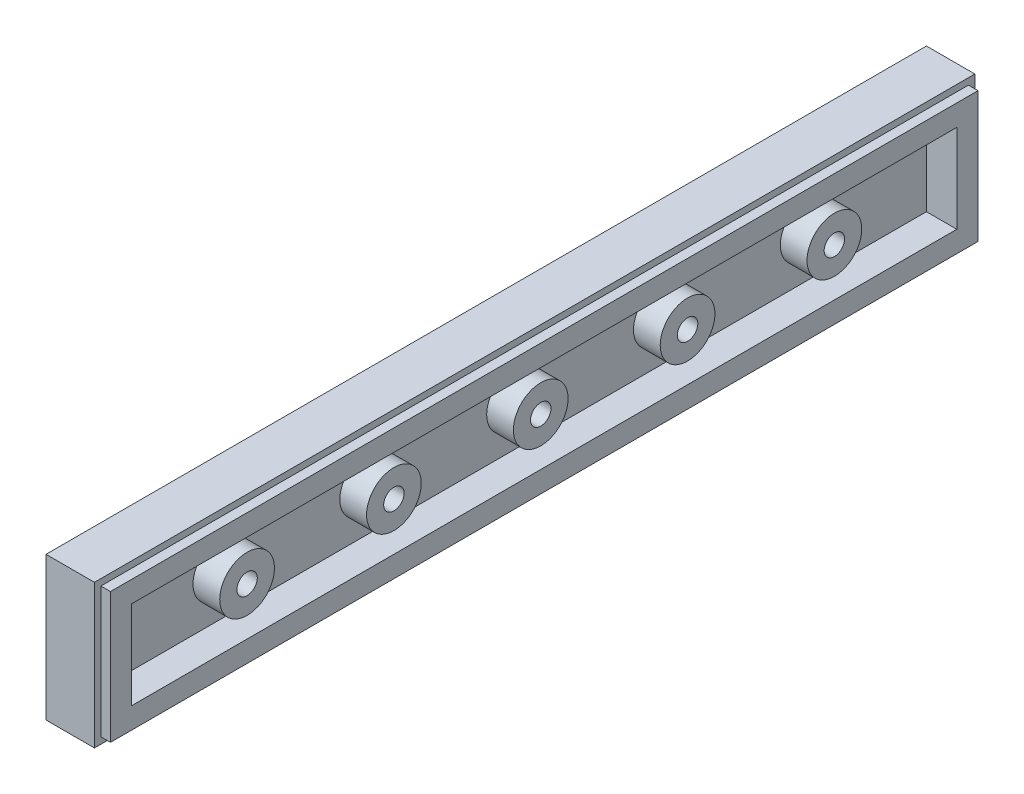
ISO-10303-21;
HEADER;
FILE_DESCRIPTION(('STEP AP214'),'2;1');
FILE_NAME('part.step','',(''),(''),'','','');
FILE_SCHEMA(('AUTOMOTIVE_DESIGN { 1 0 10303 214 1 1 1 1 }'));
ENDSEC;
DATA;
#1=APPLICATION_CONTEXT('core data for automotive mechanical design processes');
#2=APPLICATION_PROTOCOL_DEFINITION('international standard','automotive_design',2000,#1);
#3=PRODUCT_CONTEXT('',#1,'mechanical');
#4=PRODUCT('Part','Part','',(#3));
#5=PRODUCT_RELATED_PRODUCT_CATEGORY('part','',(#4));
#6=PRODUCT_DEFINITION_FORMATION('','',#4);
#7=PRODUCT_DEFINITION_CONTEXT('part definition',#1,'design');
#8=PRODUCT_DEFINITION('design','',#6,#7);
#9=PRODUCT_DEFINITION_SHAPE('','',#8);
#10=(LENGTH_UNIT() NAMED_UNIT(*) SI_UNIT(.MILLI.,.METRE.));
#11=(NAMED_UNIT(*) PLANE_ANGLE_UNIT() SI_UNIT($,.RADIAN.));
#12=(NAMED_UNIT(*) SI_UNIT($,.STERADIAN.) SOLID_ANGLE_UNIT());
#13=UNCERTAINTY_MEASURE_WITH_UNIT(LENGTH_MEASURE(1.E-05),#10,'distance_accuracy_value','');
#14=(GEOMETRIC_REPRESENTATION_CONTEXT(3) GLOBAL_UNCERTAINTY_ASSIGNED_CONTEXT((#13)) GLOBAL_UNIT_ASSIGNED_CONTEXT((#10,
#11,#12)) REPRESENTATION_CONTEXT('',''));
#15=CARTESIAN_POINT('',(0.,0.,0.));
#16=DIRECTION('',(0.,0.,1.));
#17=DIRECTION('',(1.,0.,0.));
#18=AXIS2_PLACEMENT_3D('',#15,#16,#17);
#19=CARTESIAN_POINT('',(2.63,3.895,-23.895));
#20=DIRECTION('',(0.,0.,1.));
#21=DIRECTION('',(1.,0.,0.));
#22=AXIS2_PLACEMENT_3D('',#19,#20,#21);
#23=PLANE('',#22);
#24=DIRECTION('',(0.,1.,0.));
#25=VECTOR('',#24,1.);
#26=CARTESIAN_POINT('',(0.,3.895,-23.895));
#27=LINE('',#26,#25);
#28=CARTESIAN_POINT('',(0.,-3.895,-23.895));
#29=VERTEX_POINT('',#28);
#30=CARTESIAN_POINT('',(0.,3.895,-23.895));
#31=VERTEX_POINT('',#30);
#32=EDGE_CURVE('E186',#29,#31,#27,.T.);
#33=ORIENTED_EDGE('',*,*,#32,.T.);
#34=DIRECTION('',(-1.,0.,0.));
#35=VECTOR('',#34,1.);
#36=CARTESIAN_POINT('',(2.63,3.895,-23.895));
#37=LINE('',#36,#35);
#38=CARTESIAN_POINT('',(2.63,3.895,-23.895));
#39=VERTEX_POINT('',#38);
#40=EDGE_CURVE('E221',#39,#31,#37,.T.);
#41=ORIENTED_EDGE('',*,*,#40,.F.);
#42=DIRECTION('',(0.,1.,0.));
#43=VECTOR('',#42,1.);
#44=CARTESIAN_POINT('',(2.63,3.895,-23.895));
#45=LINE('',#44,#43);
#46=CARTESIAN_POINT('',(2.63,-3.895,-23.895));
#47=VERTEX_POINT('',#46);
#48=EDGE_CURVE('E195',#47,#39,#45,.T.);
#49=ORIENTED_EDGE('',*,*,#48,.F.);
#50=DIRECTION('',(-1.,0.,0.));
#51=VECTOR('',#50,1.);
#52=CARTESIAN_POINT('',(2.63,-3.895,-23.895));
#53=LINE('',#52,#51);
#54=EDGE_CURVE('E205',#47,#29,#53,.T.);
#55=ORIENTED_EDGE('',*,*,#54,.T.);
#56=EDGE_LOOP('',(#33,#41,#49,#55));
#57=FACE_BOUND('',#56,.T.);
#58=ADVANCED_FACE('F36',(#57),#23,.F.);
#59=CARTESIAN_POINT('',(2.63,3.895,23.895));
#60=DIRECTION('',(0.,-1.,0.));
#61=DIRECTION('',(0.,0.,-1.));
#62=AXIS2_PLACEMENT_3D('',#59,#60,#61);
#63=PLANE('',#62);
#64=DIRECTION('',(0.,0.,1.));
#65=VECTOR('',#64,1.);
#66=CARTESIAN_POINT('',(0.,3.895,23.895));
#67=LINE('',#66,#65);
#68=CARTESIAN_POINT('',(0.,3.895,23.895));
#69=VERTEX_POINT('',#68);
#70=EDGE_CURVE('E208',#31,#69,#67,.T.);
#71=ORIENTED_EDGE('',*,*,#70,.T.);
#72=DIRECTION('',(-1.,0.,0.));
#73=VECTOR('',#72,1.);
#74=CARTESIAN_POINT('',(2.63,3.895,23.895));
#75=LINE('',#74,#73);
#76=CARTESIAN_POINT('',(2.63,3.895,23.895));
#77=VERTEX_POINT('',#76);
#78=EDGE_CURVE('E218',#77,#69,#75,.T.);
#79=ORIENTED_EDGE('',*,*,#78,.F.);
#80=DIRECTION('',(0.,0.,1.));
#81=VECTOR('',#80,1.);
#82=CARTESIAN_POINT('',(2.63,3.895,23.895));
#83=LINE('',#82,#81);
#84=EDGE_CURVE('E198',#39,#77,#83,.T.);
#85=ORIENTED_EDGE('',*,*,#84,.F.);
#86=ORIENTED_EDGE('',*,*,#40,.T.);
#87=EDGE_LOOP('',(#71,#79,#85,#86));
#88=FACE_BOUND('',#87,.T.);
#89=ADVANCED_FACE('F265',(#88),#63,.F.);
#90=CARTESIAN_POINT('',(2.63,3.895,23.895));
#91=DIRECTION('',(0.,0.,-1.));
#92=DIRECTION('',(-1.,0.,0.));
#93=AXIS2_PLACEMENT_3D('',#90,#91,#92);
#94=PLANE('',#93);
#95=DIRECTION('',(0.,-1.,0.));
#96=VECTOR('',#95,1.);
#97=CARTESIAN_POINT('',(0.,3.895,23.895));
#98=LINE('',#97,#96);
#99=CARTESIAN_POINT('',(0.,-3.895,23.895));
#100=VERTEX_POINT('',#99);
#101=EDGE_CURVE('E210',#69,#100,#98,.T.);
#102=ORIENTED_EDGE('',*,*,#101,.T.);
#103=DIRECTION('',(-1.,0.,0.));
#104=VECTOR('',#103,1.);
#105=CARTESIAN_POINT('',(2.63,-3.895,23.895));
#106=LINE('',#105,#104);
#107=CARTESIAN_POINT('',(2.63,-3.895,23.895));
#108=VERTEX_POINT('',#107);
#109=EDGE_CURVE('E215',#108,#100,#106,.T.);
#110=ORIENTED_EDGE('',*,*,#109,.F.);
#111=DIRECTION('',(0.,-1.,0.));
#112=VECTOR('',#111,1.);
#113=CARTESIAN_POINT('',(2.63,3.895,23.895));
#114=LINE('',#113,#112);
#115=EDGE_CURVE('E201',#77,#108,#114,.T.);
#116=ORIENTED_EDGE('',*,*,#115,.F.);
#117=ORIENTED_EDGE('',*,*,#78,.T.);
#118=EDGE_LOOP('',(#102,#110,#116,#117));
#119=FACE_BOUND('',#118,.T.);
#120=ADVANCED_FACE('F270',(#119),#94,.F.);
#121=CARTESIAN_POINT('',(2.63,-3.895,23.895));
#122=DIRECTION('',(0.,1.,0.));
#123=DIRECTION('',(0.,0.,1.));
#124=AXIS2_PLACEMENT_3D('',#121,#122,#123);
#125=PLANE('',#124);
#126=DIRECTION('',(0.,0.,-1.));
#127=VECTOR('',#126,1.);
#128=CARTESIAN_POINT('',(0.,-3.895,23.895));
#129=LINE('',#128,#127);
#130=EDGE_CURVE('E199',#100,#29,#129,.T.);
#131=ORIENTED_EDGE('',*,*,#130,.T.);
#132=ORIENTED_EDGE('',*,*,#54,.F.);
#133=DIRECTION('',(0.,0.,-1.));
#134=VECTOR('',#133,1.);
#135=CARTESIAN_POINT('',(2.63,-3.895,23.895));
#136=LINE('',#135,#134);
#137=EDGE_CURVE('E203',#108,#47,#136,.T.);
#138=ORIENTED_EDGE('',*,*,#137,.F.);
#139=ORIENTED_EDGE('',*,*,#109,.T.);
#140=EDGE_LOOP('',(#131,#132,#138,#139));
#141=FACE_BOUND('',#140,.T.);
#142=ADVANCED_FACE('F287',(#141),#125,.F.);
#143=CARTESIAN_POINT('',(2.63,0.,0.));
#144=DIRECTION('',(1.,0.,0.));
#145=DIRECTION('',(0.,0.,-1.));
#146=AXIS2_PLACEMENT_3D('',#143,#144,#145);
#147=PLANE('',#146);
#148=DIRECTION('',(0.,-1.,0.));
#149=VECTOR('',#148,1.);
#150=CARTESIAN_POINT('',(2.63,-3.54500000000001,23.545));
#151=LINE('',#150,#149);
#152=CARTESIAN_POINT('',(2.63,3.545,23.545));
#153=VERTEX_POINT('',#152);
#154=CARTESIAN_POINT('',(2.63,-3.54500000000001,23.545));
#155=VERTEX_POINT('',#154);
#156=EDGE_CURVE('E50',#153,#155,#151,.T.);
#157=ORIENTED_EDGE('',*,*,#156,.F.);
#158=DIRECTION('',(0.,0.,1.));
#159=VECTOR('',#158,1.);
#160=CARTESIAN_POINT('',(2.63,3.545,23.545));
#161=LINE('',#160,#159);
#162=CARTESIAN_POINT('',(2.63,3.545,-23.545));
#163=VERTEX_POINT('',#162);
#164=EDGE_CURVE('E54',#163,#153,#161,.T.);
#165=ORIENTED_EDGE('',*,*,#164,.F.);
#166=DIRECTION('',(0.,1.,0.));
#167=VECTOR('',#166,1.);
#168=CARTESIAN_POINT('',(2.63,3.545,-23.545));
#169=LINE('',#168,#167);
#170=CARTESIAN_POINT('',(2.63,-3.545,-23.545));
#171=VERTEX_POINT('',#170);
#172=EDGE_CURVE('E167',#171,#163,#169,.T.);
#173=ORIENTED_EDGE('',*,*,#172,.F.);
#174=DIRECTION('',(0.,0.,-1.));
#175=VECTOR('',#174,1.);
#176=CARTESIAN_POINT('',(2.63,-3.545,-23.545));
#177=LINE('',#176,#175);
#178=EDGE_CURVE('E164',#155,#171,#177,.T.);
#179=ORIENTED_EDGE('',*,*,#178,.F.);
#180=EDGE_LOOP('',(#157,#165,#173,#179));
#181=FACE_BOUND('',#180,.T.);
#182=ORIENTED_EDGE('',*,*,#48,.T.);
#183=ORIENTED_EDGE('',*,*,#84,.T.);
#184=ORIENTED_EDGE('',*,*,#115,.T.);
#185=ORIENTED_EDGE('',*,*,#137,.T.);
#186=EDGE_LOOP('',(#182,#183,#184,#185));
#187=FACE_BOUND('',#186,.T.);
#188=ADVANCED_FACE('F283',(#181,#187),#147,.T.);
#189=CARTESIAN_POINT('',(0.,0.,0.));
#190=DIRECTION('',(1.,0.,0.));
#191=DIRECTION('',(0.,0.,-1.));
#192=AXIS2_PLACEMENT_3D('',#189,#190,#191);
#193=PLANE('',#192);
#194=ORIENTED_EDGE('',*,*,#32,.F.);
#195=ORIENTED_EDGE('',*,*,#130,.F.);
#196=ORIENTED_EDGE('',*,*,#101,.F.);
#197=ORIENTED_EDGE('',*,*,#70,.F.);
#198=EDGE_LOOP('',(#194,#195,#196,#197));
#199=FACE_BOUND('',#198,.T.);
#200=ADVANCED_FACE('F278',(#199),#193,.F.);
#201=CARTESIAN_POINT('',(3.15,0.,0.));
#202=DIRECTION('',(-1.,0.,0.));
#203=DIRECTION('',(0.,0.,1.));
#204=AXIS2_PLACEMENT_3D('',#201,#202,#203);
#205=PLANE('',#204);
#206=DIRECTION('',(0.,-1.,0.));
#207=VECTOR('',#206,1.);
#208=CARTESIAN_POINT('',(3.15,-3.54500000000001,23.545));
#209=LINE('',#208,#207);
#210=CARTESIAN_POINT('',(3.15,3.545,23.545));
#211=VERTEX_POINT('',#210);
#212=CARTESIAN_POINT('',(3.15,-3.54500000000001,23.545));
#213=VERTEX_POINT('',#212);
#214=EDGE_CURVE('E153',#211,#213,#209,.T.);
#215=ORIENTED_EDGE('',*,*,#214,.T.);
#216=DIRECTION('',(0.,0.,-1.));
#217=VECTOR('',#216,1.);
#218=CARTESIAN_POINT('',(3.15,-3.545,-23.545));
#219=LINE('',#218,#217);
#220=CARTESIAN_POINT('',(3.15,-3.545,-23.545));
#221=VERTEX_POINT('',#220);
#222=EDGE_CURVE('E156',#213,#221,#219,.T.);
#223=ORIENTED_EDGE('',*,*,#222,.T.);
#224=DIRECTION('',(0.,1.,0.));
#225=VECTOR('',#224,1.);
#226=CARTESIAN_POINT('',(3.15,3.545,-23.545));
#227=LINE('',#226,#225);
#228=CARTESIAN_POINT('',(3.15,3.545,-23.545));
#229=VERTEX_POINT('',#228);
#230=EDGE_CURVE('E158',#221,#229,#227,.T.);
#231=ORIENTED_EDGE('',*,*,#230,.T.);
#232=DIRECTION('',(0.,0.,1.));
#233=VECTOR('',#232,1.);
#234=CARTESIAN_POINT('',(3.15,3.545,23.545));
#235=LINE('',#234,#233);
#236=EDGE_CURVE('E160',#229,#211,#235,.T.);
#237=ORIENTED_EDGE('',*,*,#236,.T.);
#238=EDGE_LOOP('',(#215,#223,#231,#237));
#239=FACE_BOUND('',#238,.T.);
#240=DIRECTION('',(0.,0.,1.));
#241=VECTOR('',#240,1.);
#242=CARTESIAN_POINT('',(3.15,2.395,-22.395));
#243=LINE('',#242,#241);
#244=CARTESIAN_POINT('',(3.15,2.395,-22.395));
#245=VERTEX_POINT('',#244);
#246=CARTESIAN_POINT('',(3.15,2.395,22.395));
#247=VERTEX_POINT('',#246);
#248=EDGE_CURVE('E136',#245,#247,#243,.T.);
#249=ORIENTED_EDGE('',*,*,#248,.F.);
#250=DIRECTION('',(0.,1.,0.));
#251=VECTOR('',#250,1.);
#252=CARTESIAN_POINT('',(3.15,-2.395,-22.395));
#253=LINE('',#252,#251);
#254=CARTESIAN_POINT('',(3.15,-2.395,-22.395));
#255=VERTEX_POINT('',#254);
#256=EDGE_CURVE('E148',#255,#245,#253,.T.);
#257=ORIENTED_EDGE('',*,*,#256,.F.);
#258=DIRECTION('',(0.,0.,-1.));
#259=VECTOR('',#258,1.);
#260=CARTESIAN_POINT('',(3.15,-2.395,22.395));
#261=LINE('',#260,#259);
#262=CARTESIAN_POINT('',(3.15,-2.395,22.395));
#263=VERTEX_POINT('',#262);
#264=EDGE_CURVE('E146',#263,#255,#261,.T.);
#265=ORIENTED_EDGE('',*,*,#264,.F.);
#266=DIRECTION('',(0.,-1.,0.));
#267=VECTOR('',#266,1.);
#268=CARTESIAN_POINT('',(3.15,2.395,22.395));
#269=LINE('',#268,#267);
#270=EDGE_CURVE('E128',#247,#263,#269,.T.);
#271=ORIENTED_EDGE('',*,*,#270,.F.);
#272=EDGE_LOOP('',(#249,#257,#265,#271));
#273=FACE_BOUND('',#272,.T.);
#274=ADVANCED_FACE('F144',(#239,#273),#205,.F.);
#275=CARTESIAN_POINT('',(3.15,-3.54500000000001,23.545));
#276=DIRECTION('',(0.,0.,-1.));
#277=DIRECTION('',(-1.,0.,0.));
#278=AXIS2_PLACEMENT_3D('',#275,#276,#277);
#279=PLANE('',#278);
#280=ORIENTED_EDGE('',*,*,#156,.T.);
#281=DIRECTION('',(-1.,0.,0.));
#282=VECTOR('',#281,1.);
#283=CARTESIAN_POINT('',(3.15,-3.54500000000001,23.545));
#284=LINE('',#283,#282);
#285=EDGE_CURVE('E178',#213,#155,#284,.T.);
#286=ORIENTED_EDGE('',*,*,#285,.F.);
#287=ORIENTED_EDGE('',*,*,#214,.F.);
#288=DIRECTION('',(-1.,0.,0.));
#289=VECTOR('',#288,1.);
#290=CARTESIAN_POINT('',(3.15,3.545,23.545));
#291=LINE('',#290,#289);
#292=EDGE_CURVE('E162',#211,#153,#291,.T.);
#293=ORIENTED_EDGE('',*,*,#292,.T.);
#294=EDGE_LOOP('',(#280,#286,#287,#293));
#295=FACE_BOUND('',#294,.T.);
#296=ADVANCED_FACE('F312',(#295),#279,.F.);
#297=CARTESIAN_POINT('',(3.15,-3.545,-23.545));
#298=DIRECTION('',(0.,1.,0.));
#299=DIRECTION('',(0.,0.,1.));
#300=AXIS2_PLACEMENT_3D('',#297,#298,#299);
#301=PLANE('',#300);
#302=ORIENTED_EDGE('',*,*,#178,.T.);
#303=DIRECTION('',(-1.,0.,0.));
#304=VECTOR('',#303,1.);
#305=CARTESIAN_POINT('',(3.15,-3.545,-23.545));
#306=LINE('',#305,#304);
#307=EDGE_CURVE('E175',#221,#171,#306,.T.);
#308=ORIENTED_EDGE('',*,*,#307,.F.);
#309=ORIENTED_EDGE('',*,*,#222,.F.);
#310=ORIENTED_EDGE('',*,*,#285,.T.);
#311=EDGE_LOOP('',(#302,#308,#309,#310));
#312=FACE_BOUND('',#311,.T.);
#313=ADVANCED_FACE('F320',(#312),#301,.F.);
#314=CARTESIAN_POINT('',(3.15,3.545,-23.545));
#315=DIRECTION('',(0.,0.,1.));
#316=DIRECTION('',(1.,0.,0.));
#317=AXIS2_PLACEMENT_3D('',#314,#315,#316);
#318=PLANE('',#317);
#319=ORIENTED_EDGE('',*,*,#172,.T.);
#320=DIRECTION('',(-1.,0.,0.));
#321=VECTOR('',#320,1.);
#322=CARTESIAN_POINT('',(3.15,3.545,-23.545));
#323=LINE('',#322,#321);
#324=EDGE_CURVE('E172',#229,#163,#323,.T.);
#325=ORIENTED_EDGE('',*,*,#324,.F.);
#326=ORIENTED_EDGE('',*,*,#230,.F.);
#327=ORIENTED_EDGE('',*,*,#307,.T.);
#328=EDGE_LOOP('',(#319,#325,#326,#327));
#329=FACE_BOUND('',#328,.T.);
#330=ADVANCED_FACE('F328',(#329),#318,.F.);
#331=CARTESIAN_POINT('',(3.15,3.545,23.545));
#332=DIRECTION('',(0.,-1.,0.));
#333=DIRECTION('',(0.,0.,-1.));
#334=AXIS2_PLACEMENT_3D('',#331,#332,#333);
#335=PLANE('',#334);
#336=ORIENTED_EDGE('',*,*,#164,.T.);
#337=ORIENTED_EDGE('',*,*,#292,.F.);
#338=ORIENTED_EDGE('',*,*,#236,.F.);
#339=ORIENTED_EDGE('',*,*,#324,.T.);
#340=EDGE_LOOP('',(#336,#337,#338,#339));
#341=FACE_BOUND('',#340,.T.);
#342=ADVANCED_FACE('F336',(#341),#335,.F.);
#343=CARTESIAN_POINT('',(1.5,0.,0.));
#344=DIRECTION('',(1.,0.,0.));
#345=DIRECTION('',(0.,0.,-1.));
#346=AXIS2_PLACEMENT_3D('',#343,#344,#345);
#347=PLANE('',#346);
#348=CARTESIAN_POINT('',(1.5,0.,-15.95));
#349=DIRECTION('',(1.,0.,0.));
#350=DIRECTION('',(0.,0.,-1.));
#351=AXIS2_PLACEMENT_3D('',#348,#349,#350);
#352=CIRCLE('',#351,1.485);
#353=CARTESIAN_POINT('',(1.5,0.,-17.435));
#354=VERTEX_POINT('',#353);
#355=EDGE_CURVE('E551',#354,#354,#352,.T.);
#356=ORIENTED_EDGE('',*,*,#355,.F.);
#357=EDGE_LOOP('',(#356));
#358=FACE_BOUND('',#357,.T.);
#359=CARTESIAN_POINT('',(1.5,0.,-7.98));
#360=DIRECTION('',(1.,0.,0.));
#361=DIRECTION('',(0.,0.,-1.));
#362=AXIS2_PLACEMENT_3D('',#359,#360,#361);
#363=CIRCLE('',#362,1.485);
#364=CARTESIAN_POINT('',(1.5,0.,-9.465));
#365=VERTEX_POINT('',#364);
#366=EDGE_CURVE('E558',#365,#365,#363,.T.);
#367=ORIENTED_EDGE('',*,*,#366,.F.);
#368=EDGE_LOOP('',(#367));
#369=FACE_BOUND('',#368,.T.);
#370=CARTESIAN_POINT('',(1.5,0.,-0.00999999999999959));
#371=DIRECTION('',(1.,0.,0.));
#372=DIRECTION('',(0.,0.,-1.));
#373=AXIS2_PLACEMENT_3D('',#370,#371,#372);
#374=CIRCLE('',#373,1.485);
#375=CARTESIAN_POINT('',(1.5,0.,-1.495));
#376=VERTEX_POINT('',#375);
#377=EDGE_CURVE('E567',#376,#376,#374,.T.);
#378=ORIENTED_EDGE('',*,*,#377,.F.);
#379=EDGE_LOOP('',(#378));
#380=FACE_BOUND('',#379,.T.);
#381=CARTESIAN_POINT('',(1.5,0.,7.96));
#382=DIRECTION('',(1.,0.,0.));
#383=DIRECTION('',(0.,0.,-1.));
#384=AXIS2_PLACEMENT_3D('',#381,#382,#383);
#385=CIRCLE('',#384,1.485);
#386=CARTESIAN_POINT('',(1.5,0.,6.475));
#387=VERTEX_POINT('',#386);
#388=EDGE_CURVE('E576',#387,#387,#385,.T.);
#389=ORIENTED_EDGE('',*,*,#388,.F.);
#390=EDGE_LOOP('',(#389));
#391=FACE_BOUND('',#390,.T.);
#392=CARTESIAN_POINT('',(1.5,0.,15.93));
#393=DIRECTION('',(1.,0.,0.));
#394=DIRECTION('',(0.,0.,-1.));
#395=AXIS2_PLACEMENT_3D('',#392,#393,#394);
#396=CIRCLE('',#395,1.485);
#397=CARTESIAN_POINT('',(1.5,0.,14.445));
#398=VERTEX_POINT('',#397);
#399=EDGE_CURVE('E585',#398,#398,#396,.T.);
#400=ORIENTED_EDGE('',*,*,#399,.F.);
#401=EDGE_LOOP('',(#400));
#402=FACE_BOUND('',#401,.T.);
#403=DIRECTION('',(0.,1.,0.));
#404=VECTOR('',#403,1.);
#405=CARTESIAN_POINT('',(1.5,3.895,-22.395));
#406=LINE('',#405,#404);
#407=CARTESIAN_POINT('',(1.5,-2.395,-22.395));
#408=VERTEX_POINT('',#407);
#409=CARTESIAN_POINT('',(1.5,2.395,-22.395));
#410=VERTEX_POINT('',#409);
#411=EDGE_CURVE('E181',#408,#410,#406,.T.);
#412=ORIENTED_EDGE('',*,*,#411,.T.);
#413=DIRECTION('',(0.,0.,1.));
#414=VECTOR('',#413,1.);
#415=CARTESIAN_POINT('',(1.5,2.395,23.895));
#416=LINE('',#415,#414);
#417=CARTESIAN_POINT('',(1.5,2.395,22.395));
#418=VERTEX_POINT('',#417);
#419=EDGE_CURVE('E184',#410,#418,#416,.T.);
#420=ORIENTED_EDGE('',*,*,#419,.T.);
#421=DIRECTION('',(0.,-1.,0.));
#422=VECTOR('',#421,1.);
#423=CARTESIAN_POINT('',(1.5,3.895,22.395));
#424=LINE('',#423,#422);
#425=CARTESIAN_POINT('',(1.5,-2.395,22.395));
#426=VERTEX_POINT('',#425);
#427=EDGE_CURVE('E130',#418,#426,#424,.T.);
#428=ORIENTED_EDGE('',*,*,#427,.T.);
#429=DIRECTION('',(0.,0.,-1.));
#430=VECTOR('',#429,1.);
#431=CARTESIAN_POINT('',(1.5,-2.395,23.895));
#432=LINE('',#431,#430);
#433=EDGE_CURVE('E190',#426,#408,#432,.T.);
#434=ORIENTED_EDGE('',*,*,#433,.T.);
#435=EDGE_LOOP('',(#412,#420,#428,#434));
#436=FACE_BOUND('',#435,.T.);
#437=ADVANCED_FACE('F253',(#358,#369,#380,#391,#402,#436),#347,.T.);
#438=CARTESIAN_POINT('',(2.63,2.395,23.895));
#439=DIRECTION('',(0.,-1.,0.));
#440=DIRECTION('',(0.,0.,-1.));
#441=AXIS2_PLACEMENT_3D('',#438,#439,#440);
#442=PLANE('',#441);
#443=ORIENTED_EDGE('',*,*,#419,.F.);
#444=DIRECTION('',(-1.,0.,0.));
#445=VECTOR('',#444,1.);
#446=CARTESIAN_POINT('',(2.63,2.395,-22.395));
#447=LINE('',#446,#445);
#448=EDGE_CURVE('E132',#245,#410,#447,.T.);
#449=ORIENTED_EDGE('',*,*,#448,.F.);
#450=ORIENTED_EDGE('',*,*,#248,.T.);
#451=DIRECTION('',(-1.,0.,0.));
#452=VECTOR('',#451,1.);
#453=CARTESIAN_POINT('',(2.63,2.395,22.395));
#454=LINE('',#453,#452);
#455=EDGE_CURVE('E123',#247,#418,#454,.T.);
#456=ORIENTED_EDGE('',*,*,#455,.T.);
#457=EDGE_LOOP('',(#443,#449,#450,#456));
#458=FACE_BOUND('',#457,.T.);
#459=ADVANCED_FACE('F137',(#458),#442,.T.);
#460=CARTESIAN_POINT('',(2.63,3.895,22.395));
#461=DIRECTION('',(0.,0.,-1.));
#462=DIRECTION('',(-1.,0.,0.));
#463=AXIS2_PLACEMENT_3D('',#460,#461,#462);
#464=PLANE('',#463);
#465=ORIENTED_EDGE('',*,*,#427,.F.);
#466=ORIENTED_EDGE('',*,*,#455,.F.);
#467=ORIENTED_EDGE('',*,*,#270,.T.);
#468=DIRECTION('',(-1.,0.,0.));
#469=VECTOR('',#468,1.);
#470=CARTESIAN_POINT('',(2.63,-2.395,22.395));
#471=LINE('',#470,#469);
#472=EDGE_CURVE('E133',#263,#426,#471,.T.);
#473=ORIENTED_EDGE('',*,*,#472,.T.);
#474=EDGE_LOOP('',(#465,#466,#467,#473));
#475=FACE_BOUND('',#474,.T.);
#476=ADVANCED_FACE('F125',(#475),#464,.T.);
#477=CARTESIAN_POINT('',(2.63,-2.395,23.895));
#478=DIRECTION('',(0.,1.,0.));
#479=DIRECTION('',(0.,0.,1.));
#480=AXIS2_PLACEMENT_3D('',#477,#478,#479);
#481=PLANE('',#480);
#482=ORIENTED_EDGE('',*,*,#433,.F.);
#483=ORIENTED_EDGE('',*,*,#472,.F.);
#484=ORIENTED_EDGE('',*,*,#264,.T.);
#485=DIRECTION('',(-1.,0.,0.));
#486=VECTOR('',#485,1.);
#487=CARTESIAN_POINT('',(2.63,-2.395,-22.395));
#488=LINE('',#487,#486);
#489=EDGE_CURVE('E187',#255,#408,#488,.T.);
#490=ORIENTED_EDGE('',*,*,#489,.T.);
#491=EDGE_LOOP('',(#482,#483,#484,#490));
#492=FACE_BOUND('',#491,.T.);
#493=ADVANCED_FACE('F366',(#492),#481,.T.);
#494=CARTESIAN_POINT('',(2.63,3.895,-22.395));
#495=DIRECTION('',(0.,0.,1.));
#496=DIRECTION('',(1.,0.,0.));
#497=AXIS2_PLACEMENT_3D('',#494,#495,#496);
#498=PLANE('',#497);
#499=ORIENTED_EDGE('',*,*,#411,.F.);
#500=ORIENTED_EDGE('',*,*,#489,.F.);
#501=ORIENTED_EDGE('',*,*,#256,.T.);
#502=ORIENTED_EDGE('',*,*,#448,.T.);
#503=EDGE_LOOP('',(#499,#500,#501,#502));
#504=FACE_BOUND('',#503,.T.);
#505=ADVANCED_FACE('F373',(#504),#498,.T.);
#506=CARTESIAN_POINT('',(7.3502142802481,0.,15.93));
#507=DIRECTION('',(-1.,0.,0.));
#508=DIRECTION('',(0.,0.,1.));
#509=AXIS2_PLACEMENT_3D('',#506,#507,#508);
#510=CYLINDRICAL_SURFACE('',#509,1.485);
#511=CARTESIAN_POINT('',(2.95,0.,15.93));
#512=DIRECTION('',(-1.,0.,0.));
#513=DIRECTION('',(0.,0.,1.));
#514=AXIS2_PLACEMENT_3D('',#511,#512,#513);
#515=CIRCLE('',#514,1.485);
#516=CARTESIAN_POINT('',(2.95,0.,17.415));
#517=VERTEX_POINT('',#516);
#518=EDGE_CURVE('E584',#517,#517,#515,.T.);
#519=ORIENTED_EDGE('',*,*,#518,.T.);
#520=EDGE_LOOP('',(#519));
#521=FACE_BOUND('',#520,.T.);
#522=ORIENTED_EDGE('',*,*,#399,.T.);
#523=EDGE_LOOP('',(#522));
#524=FACE_BOUND('',#523,.T.);
#525=ADVANCED_FACE('F379',(#521,#524),#510,.T.);
#526=CARTESIAN_POINT('',(7.3502142802481,0.,15.93));
#527=DIRECTION('',(-1.,0.,0.));
#528=DIRECTION('',(0.,0.,1.));
#529=AXIS2_PLACEMENT_3D('',#526,#527,#528);
#530=CYLINDRICAL_SURFACE('',#529,0.555);
#531=CARTESIAN_POINT('',(2.95,0.,15.93));
#532=DIRECTION('',(-1.,0.,0.));
#533=DIRECTION('',(0.,0.,1.));
#534=AXIS2_PLACEMENT_3D('',#531,#532,#533);
#535=CIRCLE('',#534,0.555);
#536=CARTESIAN_POINT('',(2.95,0.,16.485));
#537=VERTEX_POINT('',#536);
#538=EDGE_CURVE('E142',#537,#537,#535,.T.);
#539=ORIENTED_EDGE('',*,*,#538,.F.);
#540=EDGE_LOOP('',(#539));
#541=FACE_BOUND('',#540,.T.);
#542=CARTESIAN_POINT('',(1.5,0.,15.93));
#543=DIRECTION('',(1.,0.,0.));
#544=DIRECTION('',(0.,0.,-1.));
#545=AXIS2_PLACEMENT_3D('',#542,#543,#544);
#546=CIRCLE('',#545,0.555);
#547=CARTESIAN_POINT('',(1.5,0.,15.375));
#548=VERTEX_POINT('',#547);
#549=EDGE_CURVE('E224',#548,#548,#546,.F.);
#550=ORIENTED_EDGE('',*,*,#549,.T.);
#551=EDGE_LOOP('',(#550));
#552=FACE_BOUND('',#551,.T.);
#553=ADVANCED_FACE('F386',(#541,#552),#530,.F.);
#554=CARTESIAN_POINT('',(2.95,0.,0.));
#555=DIRECTION('',(-1.,0.,0.));
#556=DIRECTION('',(0.,0.,1.));
#557=AXIS2_PLACEMENT_3D('',#554,#555,#556);
#558=PLANE('',#557);
#559=ORIENTED_EDGE('',*,*,#538,.T.);
#560=EDGE_LOOP('',(#559));
#561=FACE_BOUND('',#560,.T.);
#562=ORIENTED_EDGE('',*,*,#518,.F.);
#563=EDGE_LOOP('',(#562));
#564=FACE_BOUND('',#563,.T.);
#565=ADVANCED_FACE('F394',(#561,#564),#558,.F.);
#566=ORIENTED_EDGE('',*,*,#549,.F.);
#567=EDGE_LOOP('',(#566));
#568=FACE_BOUND('',#567,.T.);
#569=ADVANCED_FACE('F353',(#568),#347,.T.);
#570=CARTESIAN_POINT('',(7.3502142802481,0.,7.96));
#571=DIRECTION('',(-1.,0.,0.));
#572=DIRECTION('',(0.,0.,1.));
#573=AXIS2_PLACEMENT_3D('',#570,#571,#572);
#574=CYLINDRICAL_SURFACE('',#573,1.485);
#575=CARTESIAN_POINT('',(2.95,0.,7.96));
#576=DIRECTION('',(-1.,0.,0.));
#577=DIRECTION('',(0.,0.,1.));
#578=AXIS2_PLACEMENT_3D('',#575,#576,#577);
#579=CIRCLE('',#578,1.485);
#580=CARTESIAN_POINT('',(2.95,0.,9.445));
#581=VERTEX_POINT('',#580);
#582=EDGE_CURVE('E575',#581,#581,#579,.T.);
#583=ORIENTED_EDGE('',*,*,#582,.T.);
#584=EDGE_LOOP('',(#583));
#585=FACE_BOUND('',#584,.T.);
#586=ORIENTED_EDGE('',*,*,#388,.T.);
#587=EDGE_LOOP('',(#586));
#588=FACE_BOUND('',#587,.T.);
#589=ADVANCED_FACE('F409',(#585,#588),#574,.T.);
#590=CARTESIAN_POINT('',(7.3502142802481,0.,7.96));
#591=DIRECTION('',(-1.,0.,0.));
#592=DIRECTION('',(0.,0.,1.));
#593=AXIS2_PLACEMENT_3D('',#590,#591,#592);
#594=CYLINDRICAL_SURFACE('',#593,0.555);
#595=CARTESIAN_POINT('',(2.95,0.,7.96));
#596=DIRECTION('',(-1.,0.,0.));
#597=DIRECTION('',(0.,0.,1.));
#598=AXIS2_PLACEMENT_3D('',#595,#596,#597);
#599=CIRCLE('',#598,0.555);
#600=CARTESIAN_POINT('',(2.95,0.,8.515));
#601=VERTEX_POINT('',#600);
#602=EDGE_CURVE('E579',#601,#601,#599,.T.);
#603=ORIENTED_EDGE('',*,*,#602,.F.);
#604=EDGE_LOOP('',(#603));
#605=FACE_BOUND('',#604,.T.);
#606=CARTESIAN_POINT('',(1.5,0.,7.96));
#607=DIRECTION('',(1.,0.,0.));
#608=DIRECTION('',(0.,0.,-1.));
#609=AXIS2_PLACEMENT_3D('',#606,#607,#608);
#610=CIRCLE('',#609,0.555);
#611=CARTESIAN_POINT('',(1.5,0.,7.405));
#612=VERTEX_POINT('',#611);
#613=EDGE_CURVE('E227',#612,#612,#610,.F.);
#614=ORIENTED_EDGE('',*,*,#613,.T.);
#615=EDGE_LOOP('',(#614));
#616=FACE_BOUND('',#615,.T.);
#617=ADVANCED_FACE('F416',(#605,#616),#594,.F.);
#618=CARTESIAN_POINT('',(2.95,0.,0.));
#619=DIRECTION('',(-1.,0.,0.));
#620=DIRECTION('',(0.,0.,1.));
#621=AXIS2_PLACEMENT_3D('',#618,#619,#620);
#622=PLANE('',#621);
#623=ORIENTED_EDGE('',*,*,#602,.T.);
#624=EDGE_LOOP('',(#623));
#625=FACE_BOUND('',#624,.T.);
#626=ORIENTED_EDGE('',*,*,#582,.F.);
#627=EDGE_LOOP('',(#626));
#628=FACE_BOUND('',#627,.T.);
#629=ADVANCED_FACE('F424',(#625,#628),#622,.F.);
#630=ORIENTED_EDGE('',*,*,#613,.F.);
#631=EDGE_LOOP('',(#630));
#632=FACE_BOUND('',#631,.T.);
#633=ADVANCED_FACE('F260',(#632),#347,.T.);
#634=CARTESIAN_POINT('',(7.3502142802481,0.,-0.00999999999999959));
#635=DIRECTION('',(-1.,0.,0.));
#636=DIRECTION('',(0.,0.,1.));
#637=AXIS2_PLACEMENT_3D('',#634,#635,#636);
#638=CYLINDRICAL_SURFACE('',#637,1.485);
#639=CARTESIAN_POINT('',(2.95,0.,-0.00999999999999959));
#640=DIRECTION('',(-1.,0.,0.));
#641=DIRECTION('',(0.,0.,1.));
#642=AXIS2_PLACEMENT_3D('',#639,#640,#641);
#643=CIRCLE('',#642,1.485);
#644=CARTESIAN_POINT('',(2.95,0.,1.475));
#645=VERTEX_POINT('',#644);
#646=EDGE_CURVE('E566',#645,#645,#643,.T.);
#647=ORIENTED_EDGE('',*,*,#646,.T.);
#648=EDGE_LOOP('',(#647));
#649=FACE_BOUND('',#648,.T.);
#650=ORIENTED_EDGE('',*,*,#377,.T.);
#651=EDGE_LOOP('',(#650));
#652=FACE_BOUND('',#651,.T.);
#653=ADVANCED_FACE('F439',(#649,#652),#638,.T.);
#654=CARTESIAN_POINT('',(7.3502142802481,0.,-0.00999999999999959));
#655=DIRECTION('',(-1.,0.,0.));
#656=DIRECTION('',(0.,0.,1.));
#657=AXIS2_PLACEMENT_3D('',#654,#655,#656);
#658=CYLINDRICAL_SURFACE('',#657,0.555);
#659=CARTESIAN_POINT('',(2.95,0.,-0.00999999999999959));
#660=DIRECTION('',(-1.,0.,0.));
#661=DIRECTION('',(0.,0.,1.));
#662=AXIS2_PLACEMENT_3D('',#659,#660,#661);
#663=CIRCLE('',#662,0.555);
#664=CARTESIAN_POINT('',(2.95,0.,0.545000000000001));
#665=VERTEX_POINT('',#664);
#666=EDGE_CURVE('E570',#665,#665,#663,.T.);
#667=ORIENTED_EDGE('',*,*,#666,.F.);
#668=EDGE_LOOP('',(#667));
#669=FACE_BOUND('',#668,.T.);
#670=CARTESIAN_POINT('',(1.5,0.,-0.00999999999999959));
#671=DIRECTION('',(1.,0.,0.));
#672=DIRECTION('',(0.,0.,-1.));
#673=AXIS2_PLACEMENT_3D('',#670,#671,#672);
#674=CIRCLE('',#673,0.555);
#675=CARTESIAN_POINT('',(1.5,0.,-0.565));
#676=VERTEX_POINT('',#675);
#677=EDGE_CURVE('E230',#676,#676,#674,.F.);
#678=ORIENTED_EDGE('',*,*,#677,.T.);
#679=EDGE_LOOP('',(#678));
#680=FACE_BOUND('',#679,.T.);
#681=ADVANCED_FACE('F446',(#669,#680),#658,.F.);
#682=CARTESIAN_POINT('',(2.95,0.,0.));
#683=DIRECTION('',(-1.,0.,0.));
#684=DIRECTION('',(0.,0.,1.));
#685=AXIS2_PLACEMENT_3D('',#682,#683,#684);
#686=PLANE('',#685);
#687=ORIENTED_EDGE('',*,*,#666,.T.);
#688=EDGE_LOOP('',(#687));
#689=FACE_BOUND('',#688,.T.);
#690=ORIENTED_EDGE('',*,*,#646,.F.);
#691=EDGE_LOOP('',(#690));
#692=FACE_BOUND('',#691,.T.);
#693=ADVANCED_FACE('F258',(#689,#692),#686,.F.);
#694=ORIENTED_EDGE('',*,*,#677,.F.);
#695=EDGE_LOOP('',(#694));
#696=FACE_BOUND('',#695,.T.);
#697=ADVANCED_FACE('F242',(#696),#347,.T.);
#698=CARTESIAN_POINT('',(7.3502142802481,0.,-7.98));
#699=DIRECTION('',(-1.,0.,0.));
#700=DIRECTION('',(0.,0.,1.));
#701=AXIS2_PLACEMENT_3D('',#698,#699,#700);
#702=CYLINDRICAL_SURFACE('',#701,1.485);
#703=CARTESIAN_POINT('',(2.95,0.,-7.98));
#704=DIRECTION('',(-1.,0.,0.));
#705=DIRECTION('',(0.,0.,1.));
#706=AXIS2_PLACEMENT_3D('',#703,#704,#705);
#707=CIRCLE('',#706,1.485);
#708=CARTESIAN_POINT('',(2.95,0.,-6.495));
#709=VERTEX_POINT('',#708);
#710=EDGE_CURVE('E557',#709,#709,#707,.T.);
#711=ORIENTED_EDGE('',*,*,#710,.T.);
#712=EDGE_LOOP('',(#711));
#713=FACE_BOUND('',#712,.T.);
#714=ORIENTED_EDGE('',*,*,#366,.T.);
#715=EDGE_LOOP('',(#714));
#716=FACE_BOUND('',#715,.T.);
#717=ADVANCED_FACE('F257',(#713,#716),#702,.T.);
#718=CARTESIAN_POINT('',(7.3502142802481,0.,-7.98));
#719=DIRECTION('',(-1.,0.,0.));
#720=DIRECTION('',(0.,0.,1.));
#721=AXIS2_PLACEMENT_3D('',#718,#719,#720);
#722=CYLINDRICAL_SURFACE('',#721,0.555);
#723=CARTESIAN_POINT('',(2.95,0.,-7.98));
#724=DIRECTION('',(-1.,0.,0.));
#725=DIRECTION('',(0.,0.,1.));
#726=AXIS2_PLACEMENT_3D('',#723,#724,#725);
#727=CIRCLE('',#726,0.555);
#728=CARTESIAN_POINT('',(2.95,0.,-7.425));
#729=VERTEX_POINT('',#728);
#730=EDGE_CURVE('E561',#729,#729,#727,.T.);
#731=ORIENTED_EDGE('',*,*,#730,.F.);
#732=EDGE_LOOP('',(#731));
#733=FACE_BOUND('',#732,.T.);
#734=CARTESIAN_POINT('',(1.5,0.,-7.98));
#735=DIRECTION('',(1.,0.,0.));
#736=DIRECTION('',(0.,0.,-1.));
#737=AXIS2_PLACEMENT_3D('',#734,#735,#736);
#738=CIRCLE('',#737,0.555);
#739=CARTESIAN_POINT('',(1.5,0.,-8.535));
#740=VERTEX_POINT('',#739);
#741=EDGE_CURVE('E43',#740,#740,#738,.F.);
#742=ORIENTED_EDGE('',*,*,#741,.T.);
#743=EDGE_LOOP('',(#742));
#744=FACE_BOUND('',#743,.T.);
#745=ADVANCED_FACE('F235',(#733,#744),#722,.F.);
#746=CARTESIAN_POINT('',(2.95,0.,0.));
#747=DIRECTION('',(-1.,0.,0.));
#748=DIRECTION('',(0.,0.,1.));
#749=AXIS2_PLACEMENT_3D('',#746,#747,#748);
#750=PLANE('',#749);
#751=ORIENTED_EDGE('',*,*,#730,.T.);
#752=EDGE_LOOP('',(#751));
#753=FACE_BOUND('',#752,.T.);
#754=ORIENTED_EDGE('',*,*,#710,.F.);
#755=EDGE_LOOP('',(#754));
#756=FACE_BOUND('',#755,.T.);
#757=ADVANCED_FACE('F240',(#753,#756),#750,.F.);
#758=ORIENTED_EDGE('',*,*,#741,.F.);
#759=EDGE_LOOP('',(#758));
#760=FACE_BOUND('',#759,.T.);
#761=ADVANCED_FACE('F237',(#760),#347,.T.);
#762=CARTESIAN_POINT('',(7.3502142802481,0.,-15.95));
#763=DIRECTION('',(-1.,0.,0.));
#764=DIRECTION('',(0.,0.,1.));
#765=AXIS2_PLACEMENT_3D('',#762,#763,#764);
#766=CYLINDRICAL_SURFACE('',#765,1.485);
#767=CARTESIAN_POINT('',(2.95,0.,-15.95));
#768=DIRECTION('',(-1.,0.,0.));
#769=DIRECTION('',(0.,0.,1.));
#770=AXIS2_PLACEMENT_3D('',#767,#768,#769);
#771=CIRCLE('',#770,1.485);
#772=CARTESIAN_POINT('',(2.95,0.,-14.465));
#773=VERTEX_POINT('',#772);
#774=EDGE_CURVE('E550',#773,#773,#771,.T.);
#775=ORIENTED_EDGE('',*,*,#774,.T.);
#776=EDGE_LOOP('',(#775));
#777=FACE_BOUND('',#776,.T.);
#778=ORIENTED_EDGE('',*,*,#355,.T.);
#779=EDGE_LOOP('',(#778));
#780=FACE_BOUND('',#779,.T.);
#781=ADVANCED_FACE('F239',(#777,#780),#766,.T.);
#782=CARTESIAN_POINT('',(7.3502142802481,0.,-15.95));
#783=DIRECTION('',(-1.,0.,0.));
#784=DIRECTION('',(0.,0.,1.));
#785=AXIS2_PLACEMENT_3D('',#782,#783,#784);
#786=CYLINDRICAL_SURFACE('',#785,0.555000000000001);
#787=CARTESIAN_POINT('',(2.95,0.,-15.95));
#788=DIRECTION('',(-1.,0.,0.));
#789=DIRECTION('',(0.,0.,1.));
#790=AXIS2_PLACEMENT_3D('',#787,#788,#789);
#791=CIRCLE('',#790,0.555000000000001);
#792=CARTESIAN_POINT('',(2.95,0.,-15.395));
#793=VERTEX_POINT('',#792);
#794=EDGE_CURVE('E547',#793,#793,#791,.T.);
#795=ORIENTED_EDGE('',*,*,#794,.F.);
#796=EDGE_LOOP('',(#795));
#797=FACE_BOUND('',#796,.T.);
#798=CARTESIAN_POINT('',(1.5,0.,-15.95));
#799=DIRECTION('',(1.,0.,0.));
#800=DIRECTION('',(0.,0.,-1.));
#801=AXIS2_PLACEMENT_3D('',#798,#799,#800);
#802=CIRCLE('',#801,0.555000000000001);
#803=CARTESIAN_POINT('',(1.5,0.,-16.505));
#804=VERTEX_POINT('',#803);
#805=EDGE_CURVE('E12',#804,#804,#802,.F.);
#806=ORIENTED_EDGE('',*,*,#805,.T.);
#807=EDGE_LOOP('',(#806));
#808=FACE_BOUND('',#807,.T.);
#809=ADVANCED_FACE('F248',(#797,#808),#786,.F.);
#810=CARTESIAN_POINT('',(2.95,0.,0.));
#811=DIRECTION('',(-1.,0.,0.));
#812=DIRECTION('',(0.,0.,1.));
#813=AXIS2_PLACEMENT_3D('',#810,#811,#812);
#814=PLANE('',#813);
#815=ORIENTED_EDGE('',*,*,#794,.T.);
#816=EDGE_LOOP('',(#815));
#817=FACE_BOUND('',#816,.T.);
#818=ORIENTED_EDGE('',*,*,#774,.F.);
#819=EDGE_LOOP('',(#818));
#820=FACE_BOUND('',#819,.T.);
#821=ADVANCED_FACE('F262',(#817,#820),#814,.F.);
#822=ORIENTED_EDGE('',*,*,#805,.F.);
#823=EDGE_LOOP('',(#822));
#824=FACE_BOUND('',#823,.T.);
#825=ADVANCED_FACE('F243',(#824),#347,.T.);
#826=CLOSED_SHELL('',(#58,#89,#120,#142,#188,#200,#274,#296,#313,#330,#342,#437,#459,#476,#493,
#505,#525,#553,#565,#569,#589,#617,#629,#633,#653,#681,#693,#697,#717,#745,#757,#761,#781,#809,
#821,#825));
#827=MANIFOLD_SOLID_BREP('B2',#826);
#828=ADVANCED_BREP_SHAPE_REPRESENTATION('',(#18,#827),#14);
#829=SHAPE_DEFINITION_REPRESENTATION(#9,#828);
ENDSEC;
END-ISO-10303-21;
